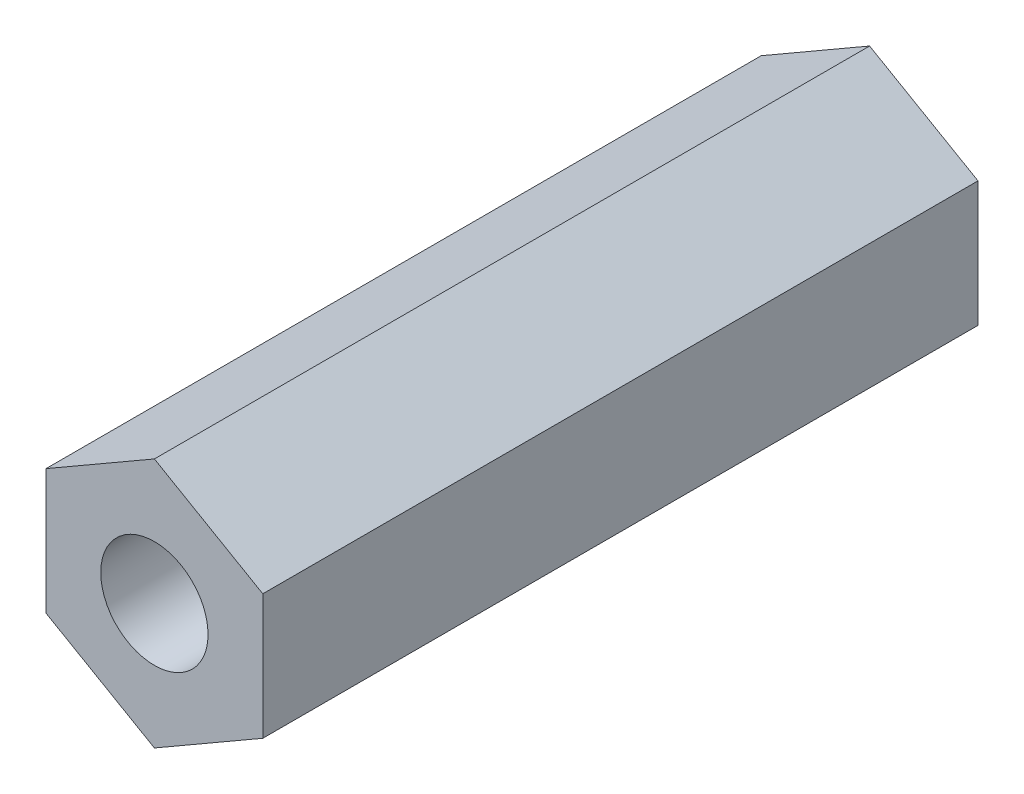
ISO-10303-21;
HEADER;
FILE_DESCRIPTION(('STEP AP214'),'2;1');
FILE_NAME('part.step','',(''),(''),'','','');
FILE_SCHEMA(('AUTOMOTIVE_DESIGN { 1 0 10303 214 1 1 1 1 }'));
ENDSEC;
DATA;
#1=APPLICATION_CONTEXT('core data for automotive mechanical design processes');
#2=APPLICATION_PROTOCOL_DEFINITION('international standard','automotive_design',2000,#1);
#3=PRODUCT_CONTEXT('',#1,'mechanical');
#4=PRODUCT('Part','Part','',(#3));
#5=PRODUCT_RELATED_PRODUCT_CATEGORY('part','',(#4));
#6=PRODUCT_DEFINITION_FORMATION('','',#4);
#7=PRODUCT_DEFINITION_CONTEXT('part definition',#1,'design');
#8=PRODUCT_DEFINITION('design','',#6,#7);
#9=PRODUCT_DEFINITION_SHAPE('','',#8);
#10=(LENGTH_UNIT() NAMED_UNIT(*) SI_UNIT(.MILLI.,.METRE.));
#11=(NAMED_UNIT(*) PLANE_ANGLE_UNIT() SI_UNIT($,.RADIAN.));
#12=(NAMED_UNIT(*) SI_UNIT($,.STERADIAN.) SOLID_ANGLE_UNIT());
#13=UNCERTAINTY_MEASURE_WITH_UNIT(LENGTH_MEASURE(1.E-05),#10,'distance_accuracy_value','');
#14=(GEOMETRIC_REPRESENTATION_CONTEXT(3) GLOBAL_UNCERTAINTY_ASSIGNED_CONTEXT((#13)) GLOBAL_UNIT_ASSIGNED_CONTEXT((#10,
#11,#12)) REPRESENTATION_CONTEXT('',''));
#15=CARTESIAN_POINT('',(0.,0.,0.));
#16=DIRECTION('',(0.,0.,1.));
#17=DIRECTION('',(1.,0.,0.));
#18=AXIS2_PLACEMENT_3D('',#15,#16,#17);
#19=CARTESIAN_POINT('',(3.03108891324553,-1.75,20.));
#20=DIRECTION('',(-1.,0.,0.));
#21=DIRECTION('',(0.,0.,1.));
#22=AXIS2_PLACEMENT_3D('',#19,#20,#21);
#23=PLANE('',#22);
#24=DIRECTION('',(0.,1.,0.));
#25=VECTOR('',#24,1.);
#26=CARTESIAN_POINT('',(3.03108891324553,-1.75,0.));
#27=LINE('',#26,#25);
#28=CARTESIAN_POINT('',(3.03108891324553,-1.75,0.));
#29=VERTEX_POINT('',#28);
#30=CARTESIAN_POINT('',(3.03108891324553,1.75,0.));
#31=VERTEX_POINT('',#30);
#32=EDGE_CURVE('E119',#29,#31,#27,.T.);
#33=ORIENTED_EDGE('',*,*,#32,.T.);
#34=DIRECTION('',(0.,0.,-1.));
#35=VECTOR('',#34,1.);
#36=CARTESIAN_POINT('',(3.03108891324553,1.75,20.));
#37=LINE('',#36,#35);
#38=CARTESIAN_POINT('',(3.03108891324553,1.75,20.));
#39=VERTEX_POINT('',#38);
#40=EDGE_CURVE('E11',#39,#31,#37,.T.);
#41=ORIENTED_EDGE('',*,*,#40,.F.);
#42=DIRECTION('',(0.,1.,0.));
#43=VECTOR('',#42,1.);
#44=CARTESIAN_POINT('',(3.03108891324553,-1.75,20.));
#45=LINE('',#44,#43);
#46=CARTESIAN_POINT('',(3.03108891324553,-1.75,20.));
#47=VERTEX_POINT('',#46);
#48=EDGE_CURVE('E130',#47,#39,#45,.T.);
#49=ORIENTED_EDGE('',*,*,#48,.F.);
#50=DIRECTION('',(0.,0.,-1.));
#51=VECTOR('',#50,1.);
#52=CARTESIAN_POINT('',(3.03108891324553,-1.75,20.));
#53=LINE('',#52,#51);
#54=EDGE_CURVE('E115',#47,#29,#53,.T.);
#55=ORIENTED_EDGE('',*,*,#54,.T.);
#56=EDGE_LOOP('',(#33,#41,#49,#55));
#57=FACE_BOUND('',#56,.T.);
#58=ADVANCED_FACE('F35',(#57),#23,.F.);
#59=CARTESIAN_POINT('',(3.03108891324553,1.75,20.));
#60=DIRECTION('',(-0.5,-0.866025403784439,0.));
#61=DIRECTION('',(0.866025403784439,-0.5,0.));
#62=AXIS2_PLACEMENT_3D('',#59,#60,#61);
#63=PLANE('',#62);
#64=DIRECTION('',(-0.866025403784439,0.5,0.));
#65=VECTOR('',#64,1.);
#66=CARTESIAN_POINT('',(3.03108891324553,1.75,0.));
#67=LINE('',#66,#65);
#68=CARTESIAN_POINT('',(0.,3.5,0.));
#69=VERTEX_POINT('',#68);
#70=EDGE_CURVE('E122',#31,#69,#67,.T.);
#71=ORIENTED_EDGE('',*,*,#70,.T.);
#72=DIRECTION('',(0.,0.,-1.));
#73=VECTOR('',#72,1.);
#74=CARTESIAN_POINT('',(0.,3.5,20.));
#75=LINE('',#74,#73);
#76=CARTESIAN_POINT('',(0.,3.5,20.));
#77=VERTEX_POINT('',#76);
#78=EDGE_CURVE('E43',#77,#69,#75,.T.);
#79=ORIENTED_EDGE('',*,*,#78,.F.);
#80=DIRECTION('',(-0.866025403784439,0.5,0.));
#81=VECTOR('',#80,1.);
#82=CARTESIAN_POINT('',(3.03108891324553,1.75,20.));
#83=LINE('',#82,#81);
#84=EDGE_CURVE('E88',#39,#77,#83,.T.);
#85=ORIENTED_EDGE('',*,*,#84,.F.);
#86=ORIENTED_EDGE('',*,*,#40,.T.);
#87=EDGE_LOOP('',(#71,#79,#85,#86));
#88=FACE_BOUND('',#87,.T.);
#89=ADVANCED_FACE('F155',(#88),#63,.F.);
#90=CARTESIAN_POINT('',(0.,3.5,20.));
#91=DIRECTION('',(0.5,-0.866025403784438,0.));
#92=DIRECTION('',(0.866025403784439,0.5,0.));
#93=AXIS2_PLACEMENT_3D('',#90,#91,#92);
#94=PLANE('',#93);
#95=DIRECTION('',(-0.866025403784438,-0.5,0.));
#96=VECTOR('',#95,1.);
#97=CARTESIAN_POINT('',(0.,3.5,0.));
#98=LINE('',#97,#96);
#99=CARTESIAN_POINT('',(-3.03108891324554,1.75,0.));
#100=VERTEX_POINT('',#99);
#101=EDGE_CURVE('E125',#69,#100,#98,.T.);
#102=ORIENTED_EDGE('',*,*,#101,.T.);
#103=DIRECTION('',(0.,0.,-1.));
#104=VECTOR('',#103,1.);
#105=CARTESIAN_POINT('',(-3.03108891324554,1.75,20.));
#106=LINE('',#105,#104);
#107=CARTESIAN_POINT('',(-3.03108891324554,1.75,20.));
#108=VERTEX_POINT('',#107);
#109=EDGE_CURVE('E110',#108,#100,#106,.T.);
#110=ORIENTED_EDGE('',*,*,#109,.F.);
#111=DIRECTION('',(-0.866025403784438,-0.5,0.));
#112=VECTOR('',#111,1.);
#113=CARTESIAN_POINT('',(0.,3.5,20.));
#114=LINE('',#113,#112);
#115=EDGE_CURVE('E101',#77,#108,#114,.T.);
#116=ORIENTED_EDGE('',*,*,#115,.F.);
#117=ORIENTED_EDGE('',*,*,#78,.T.);
#118=EDGE_LOOP('',(#102,#110,#116,#117));
#119=FACE_BOUND('',#118,.T.);
#120=ADVANCED_FACE('F136',(#119),#94,.F.);
#121=CARTESIAN_POINT('',(-3.03108891324554,1.75,20.));
#122=DIRECTION('',(1.,0.,0.));
#123=DIRECTION('',(0.,1.,0.));
#124=AXIS2_PLACEMENT_3D('',#121,#122,#123);
#125=PLANE('',#124);
#126=DIRECTION('',(0.,-1.,0.));
#127=VECTOR('',#126,1.);
#128=CARTESIAN_POINT('',(-3.03108891324554,1.75,0.));
#129=LINE('',#128,#127);
#130=CARTESIAN_POINT('',(-3.03108891324554,-1.75,0.));
#131=VERTEX_POINT('',#130);
#132=EDGE_CURVE('E109',#100,#131,#129,.T.);
#133=ORIENTED_EDGE('',*,*,#132,.T.);
#134=DIRECTION('',(0.,0.,-1.));
#135=VECTOR('',#134,1.);
#136=CARTESIAN_POINT('',(-3.03108891324554,-1.75,20.));
#137=LINE('',#136,#135);
#138=CARTESIAN_POINT('',(-3.03108891324554,-1.75,20.));
#139=VERTEX_POINT('',#138);
#140=EDGE_CURVE('E106',#139,#131,#137,.T.);
#141=ORIENTED_EDGE('',*,*,#140,.F.);
#142=DIRECTION('',(0.,-1.,0.));
#143=VECTOR('',#142,1.);
#144=CARTESIAN_POINT('',(-3.03108891324554,1.75,20.));
#145=LINE('',#144,#143);
#146=EDGE_CURVE('E95',#108,#139,#145,.T.);
#147=ORIENTED_EDGE('',*,*,#146,.F.);
#148=ORIENTED_EDGE('',*,*,#109,.T.);
#149=EDGE_LOOP('',(#133,#141,#147,#148));
#150=FACE_BOUND('',#149,.T.);
#151=ADVANCED_FACE('F107',(#150),#125,.F.);
#152=CARTESIAN_POINT('',(-3.03108891324554,-1.75,20.));
#153=DIRECTION('',(0.5,0.866025403784439,0.));
#154=DIRECTION('',(-0.866025403784439,0.5,0.));
#155=AXIS2_PLACEMENT_3D('',#152,#153,#154);
#156=PLANE('',#155);
#157=DIRECTION('',(0.866025403784439,-0.5,0.));
#158=VECTOR('',#157,1.);
#159=CARTESIAN_POINT('',(-3.03108891324554,-1.75,0.));
#160=LINE('',#159,#158);
#161=CARTESIAN_POINT('',(0.,-3.5,0.));
#162=VERTEX_POINT('',#161);
#163=EDGE_CURVE('E74',#131,#162,#160,.T.);
#164=ORIENTED_EDGE('',*,*,#163,.T.);
#165=DIRECTION('',(0.,0.,-1.));
#166=VECTOR('',#165,1.);
#167=CARTESIAN_POINT('',(0.,-3.5,20.));
#168=LINE('',#167,#166);
#169=CARTESIAN_POINT('',(0.,-3.5,20.));
#170=VERTEX_POINT('',#169);
#171=EDGE_CURVE('E111',#170,#162,#168,.T.);
#172=ORIENTED_EDGE('',*,*,#171,.F.);
#173=DIRECTION('',(0.866025403784439,-0.5,0.));
#174=VECTOR('',#173,1.);
#175=CARTESIAN_POINT('',(-3.03108891324554,-1.75,20.));
#176=LINE('',#175,#174);
#177=EDGE_CURVE('E99',#139,#170,#176,.T.);
#178=ORIENTED_EDGE('',*,*,#177,.F.);
#179=ORIENTED_EDGE('',*,*,#140,.T.);
#180=EDGE_LOOP('',(#164,#172,#178,#179));
#181=FACE_BOUND('',#180,.T.);
#182=ADVANCED_FACE('F113',(#181),#156,.F.);
#183=CARTESIAN_POINT('',(0.,-3.5,20.));
#184=DIRECTION('',(-0.5,0.866025403784438,0.));
#185=DIRECTION('',(-0.866025403784438,-0.5,0.));
#186=AXIS2_PLACEMENT_3D('',#183,#184,#185);
#187=PLANE('',#186);
#188=DIRECTION('',(0.866025403784438,0.5,0.));
#189=VECTOR('',#188,1.);
#190=CARTESIAN_POINT('',(0.,-3.5,0.));
#191=LINE('',#190,#189);
#192=EDGE_CURVE('E80',#162,#29,#191,.T.);
#193=ORIENTED_EDGE('',*,*,#192,.T.);
#194=ORIENTED_EDGE('',*,*,#54,.F.);
#195=DIRECTION('',(0.866025403784438,0.5,0.));
#196=VECTOR('',#195,1.);
#197=CARTESIAN_POINT('',(0.,-3.5,20.));
#198=LINE('',#197,#196);
#199=EDGE_CURVE('E51',#170,#47,#198,.T.);
#200=ORIENTED_EDGE('',*,*,#199,.F.);
#201=ORIENTED_EDGE('',*,*,#171,.T.);
#202=EDGE_LOOP('',(#193,#194,#200,#201));
#203=FACE_BOUND('',#202,.T.);
#204=ADVANCED_FACE('F143',(#203),#187,.F.);
#205=CARTESIAN_POINT('',(0.,0.,20.));
#206=DIRECTION('',(0.,0.,1.));
#207=DIRECTION('',(1.,0.,0.));
#208=AXIS2_PLACEMENT_3D('',#205,#206,#207);
#209=PLANE('',#208);
#210=CARTESIAN_POINT('',(0.,0.,20.));
#211=DIRECTION('',(0.,0.,-1.));
#212=DIRECTION('',(-1.,0.,0.));
#213=AXIS2_PLACEMENT_3D('',#210,#211,#212);
#214=CIRCLE('',#213,1.5);
#215=CARTESIAN_POINT('',(-1.5,0.,20.));
#216=VERTEX_POINT('',#215);
#217=EDGE_CURVE('E123',#216,#216,#214,.T.);
#218=ORIENTED_EDGE('',*,*,#217,.T.);
#219=EDGE_LOOP('',(#218));
#220=FACE_BOUND('',#219,.T.);
#221=ORIENTED_EDGE('',*,*,#48,.T.);
#222=ORIENTED_EDGE('',*,*,#84,.T.);
#223=ORIENTED_EDGE('',*,*,#115,.T.);
#224=ORIENTED_EDGE('',*,*,#146,.T.);
#225=ORIENTED_EDGE('',*,*,#177,.T.);
#226=ORIENTED_EDGE('',*,*,#199,.T.);
#227=EDGE_LOOP('',(#221,#222,#223,#224,#225,#226));
#228=FACE_BOUND('',#227,.T.);
#229=ADVANCED_FACE('F97',(#220,#228),#209,.T.);
#230=CARTESIAN_POINT('',(0.,0.,0.));
#231=DIRECTION('',(0.,0.,1.));
#232=DIRECTION('',(1.,0.,0.));
#233=AXIS2_PLACEMENT_3D('',#230,#231,#232);
#234=PLANE('',#233);
#235=CARTESIAN_POINT('',(0.,0.,0.));
#236=DIRECTION('',(0.,0.,-1.));
#237=DIRECTION('',(-1.,0.,0.));
#238=AXIS2_PLACEMENT_3D('',#235,#236,#237);
#239=CIRCLE('',#238,1.5);
#240=CARTESIAN_POINT('',(-1.5,0.,0.));
#241=VERTEX_POINT('',#240);
#242=EDGE_CURVE('E210',#241,#241,#239,.T.);
#243=ORIENTED_EDGE('',*,*,#242,.F.);
#244=EDGE_LOOP('',(#243));
#245=FACE_BOUND('',#244,.T.);
#246=ORIENTED_EDGE('',*,*,#32,.F.);
#247=ORIENTED_EDGE('',*,*,#192,.F.);
#248=ORIENTED_EDGE('',*,*,#163,.F.);
#249=ORIENTED_EDGE('',*,*,#132,.F.);
#250=ORIENTED_EDGE('',*,*,#101,.F.);
#251=ORIENTED_EDGE('',*,*,#70,.F.);
#252=EDGE_LOOP('',(#246,#247,#248,#249,#250,#251));
#253=FACE_BOUND('',#252,.T.);
#254=ADVANCED_FACE('F139',(#245,#253),#234,.F.);
#255=CARTESIAN_POINT('',(0.,0.,20.));
#256=DIRECTION('',(0.,0.,-1.));
#257=DIRECTION('',(-1.,0.,0.));
#258=AXIS2_PLACEMENT_3D('',#255,#256,#257);
#259=CYLINDRICAL_SURFACE('',#258,1.5);
#260=ORIENTED_EDGE('',*,*,#217,.F.);
#261=EDGE_LOOP('',(#260));
#262=FACE_BOUND('',#261,.T.);
#263=ORIENTED_EDGE('',*,*,#242,.T.);
#264=EDGE_LOOP('',(#263));
#265=FACE_BOUND('',#264,.T.);
#266=ADVANCED_FACE('F192',(#262,#265),#259,.F.);
#267=CLOSED_SHELL('',(#58,#89,#120,#151,#182,#204,#229,#254,#266));
#268=MANIFOLD_SOLID_BREP('B2',#267);
#269=ADVANCED_BREP_SHAPE_REPRESENTATION('',(#18,#268),#14);
#270=SHAPE_DEFINITION_REPRESENTATION(#9,#269);
ENDSEC;
END-ISO-10303-21;
